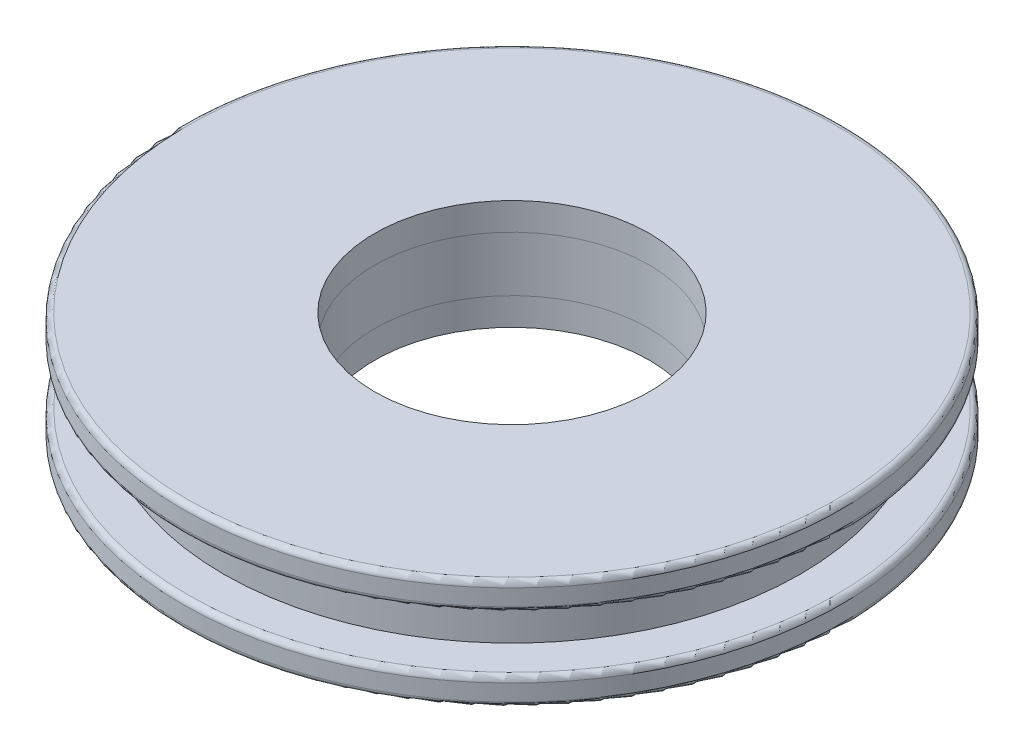
ISO-10303-21;
HEADER;
FILE_DESCRIPTION(('STEP AP214'),'2;1');
FILE_NAME('part.step','',(''),(''),'','','');
FILE_SCHEMA(('AUTOMOTIVE_DESIGN { 1 0 10303 214 1 1 1 1 }'));
ENDSEC;
DATA;
#1=APPLICATION_CONTEXT('core data for automotive mechanical design processes');
#2=APPLICATION_PROTOCOL_DEFINITION('international standard','automotive_design',2000,#1);
#3=PRODUCT_CONTEXT('',#1,'mechanical');
#4=PRODUCT('Part','Part','',(#3));
#5=PRODUCT_RELATED_PRODUCT_CATEGORY('part','',(#4));
#6=PRODUCT_DEFINITION_FORMATION('','',#4);
#7=PRODUCT_DEFINITION_CONTEXT('part definition',#1,'design');
#8=PRODUCT_DEFINITION('design','',#6,#7);
#9=PRODUCT_DEFINITION_SHAPE('','',#8);
#10=(LENGTH_UNIT() NAMED_UNIT(*) SI_UNIT(.MILLI.,.METRE.));
#11=(NAMED_UNIT(*) PLANE_ANGLE_UNIT() SI_UNIT($,.RADIAN.));
#12=(NAMED_UNIT(*) SI_UNIT($,.STERADIAN.) SOLID_ANGLE_UNIT());
#13=UNCERTAINTY_MEASURE_WITH_UNIT(LENGTH_MEASURE(1.E-05),#10,'distance_accuracy_value','');
#14=(GEOMETRIC_REPRESENTATION_CONTEXT(3) GLOBAL_UNCERTAINTY_ASSIGNED_CONTEXT((#13)) GLOBAL_UNIT_ASSIGNED_CONTEXT((#10,
#11,#12)) REPRESENTATION_CONTEXT('',''));
#15=CARTESIAN_POINT('',(0.,0.,0.));
#16=DIRECTION('',(0.,0.,1.));
#17=DIRECTION('',(1.,0.,0.));
#18=AXIS2_PLACEMENT_3D('',#15,#16,#17);
#19=CARTESIAN_POINT('',(0.,4.,0.));
#20=DIRECTION('',(0.,1.,0.));
#21=DIRECTION('',(0.,0.,1.));
#22=AXIS2_PLACEMENT_3D('',#19,#20,#21);
#23=PLANE('',#22);
#24=CARTESIAN_POINT('',(0.,4.,0.));
#25=DIRECTION('',(0.,1.,0.));
#26=DIRECTION('',(0.,0.,1.));
#27=AXIS2_PLACEMENT_3D('',#24,#25,#26);
#28=CIRCLE('',#27,11.8);
#29=CARTESIAN_POINT('',(0.,4.,11.8));
#30=VERTEX_POINT('',#29);
#31=EDGE_CURVE('E56',#30,#30,#28,.T.);
#32=ORIENTED_EDGE('',*,*,#31,.T.);
#33=EDGE_LOOP('',(#32));
#34=FACE_BOUND('',#33,.T.);
#35=CARTESIAN_POINT('',(0.,4.,0.));
#36=DIRECTION('',(0.,1.,0.));
#37=DIRECTION('',(0.,0.,1.));
#38=AXIS2_PLACEMENT_3D('',#35,#36,#37);
#39=CIRCLE('',#38,5.);
#40=CARTESIAN_POINT('',(0.,4.,5.));
#41=VERTEX_POINT('',#40);
#42=EDGE_CURVE('E61',#41,#41,#39,.T.);
#43=ORIENTED_EDGE('',*,*,#42,.F.);
#44=EDGE_LOOP('',(#43));
#45=FACE_BOUND('',#44,.T.);
#46=ADVANCED_FACE('F41',(#34,#45),#23,.T.);
#47=CARTESIAN_POINT('',(0.,3.,0.));
#48=DIRECTION('',(0.,1.,0.));
#49=DIRECTION('',(0.,0.,1.));
#50=AXIS2_PLACEMENT_3D('',#47,#48,#49);
#51=PLANE('',#50);
#52=CARTESIAN_POINT('',(0.,3.,0.));
#53=DIRECTION('',(0.,1.,0.));
#54=DIRECTION('',(0.,0.,1.));
#55=AXIS2_PLACEMENT_3D('',#52,#53,#54);
#56=CIRCLE('',#55,11.8);
#57=CARTESIAN_POINT('',(0.,3.,11.8));
#58=VERTEX_POINT('',#57);
#59=EDGE_CURVE('E11',#58,#58,#56,.F.);
#60=ORIENTED_EDGE('',*,*,#59,.T.);
#61=EDGE_LOOP('',(#60));
#62=FACE_BOUND('',#61,.T.);
#63=CARTESIAN_POINT('',(0.,3.,0.));
#64=DIRECTION('',(0.,1.,0.));
#65=DIRECTION('',(0.,0.,1.));
#66=AXIS2_PLACEMENT_3D('',#63,#64,#65);
#67=CIRCLE('',#66,5.);
#68=CARTESIAN_POINT('',(0.,3.,5.));
#69=VERTEX_POINT('',#68);
#70=EDGE_CURVE('E62',#69,#69,#67,.T.);
#71=ORIENTED_EDGE('',*,*,#70,.T.);
#72=EDGE_LOOP('',(#71));
#73=FACE_BOUND('',#72,.T.);
#74=ADVANCED_FACE('F72',(#62,#73),#51,.F.);
#75=CARTESIAN_POINT('',(0.,4.,0.));
#76=DIRECTION('',(0.,-1.,0.));
#77=DIRECTION('',(0.,0.,-1.));
#78=AXIS2_PLACEMENT_3D('',#75,#76,#77);
#79=CYLINDRICAL_SURFACE('',#78,12.);
#80=CARTESIAN_POINT('',(0.,3.2,0.));
#81=DIRECTION('',(0.,1.,0.));
#82=DIRECTION('',(0.,0.,1.));
#83=AXIS2_PLACEMENT_3D('',#80,#81,#82);
#84=CIRCLE('',#83,12.);
#85=CARTESIAN_POINT('',(0.,3.2,12.));
#86=VERTEX_POINT('',#85);
#87=EDGE_CURVE('E48',#86,#86,#84,.T.);
#88=ORIENTED_EDGE('',*,*,#87,.T.);
#89=EDGE_LOOP('',(#88));
#90=FACE_BOUND('',#89,.T.);
#91=CARTESIAN_POINT('',(0.,3.8,0.));
#92=DIRECTION('',(0.,1.,0.));
#93=DIRECTION('',(0.,0.,1.));
#94=AXIS2_PLACEMENT_3D('',#91,#92,#93);
#95=CIRCLE('',#94,12.);
#96=CARTESIAN_POINT('',(0.,3.8,12.));
#97=VERTEX_POINT('',#96);
#98=EDGE_CURVE('E52',#97,#97,#95,.F.);
#99=ORIENTED_EDGE('',*,*,#98,.T.);
#100=EDGE_LOOP('',(#99));
#101=FACE_BOUND('',#100,.T.);
#102=ADVANCED_FACE('F78',(#90,#101),#79,.T.);
#103=CARTESIAN_POINT('',(0.,4.,0.));
#104=DIRECTION('',(0.,-1.,0.));
#105=DIRECTION('',(0.,0.,-1.));
#106=AXIS2_PLACEMENT_3D('',#103,#104,#105);
#107=CYLINDRICAL_SURFACE('',#106,5.);
#108=ORIENTED_EDGE('',*,*,#42,.T.);
#109=EDGE_LOOP('',(#108));
#110=FACE_BOUND('',#109,.T.);
#111=ORIENTED_EDGE('',*,*,#70,.F.);
#112=EDGE_LOOP('',(#111));
#113=FACE_BOUND('',#112,.T.);
#114=ADVANCED_FACE('F68',(#110,#113),#107,.F.);
#115=CARTESIAN_POINT('',(0.,3.8,0.));
#116=DIRECTION('',(0.,1.,0.));
#117=DIRECTION('',(0.,0.,1.));
#118=AXIS2_PLACEMENT_3D('',#115,#116,#117);
#119=TOROIDAL_SURFACE('',#118,11.8,0.2);
#120=ORIENTED_EDGE('',*,*,#98,.F.);
#121=EDGE_LOOP('',(#120));
#122=FACE_BOUND('',#121,.T.);
#123=ORIENTED_EDGE('',*,*,#31,.F.);
#124=EDGE_LOOP('',(#123));
#125=FACE_BOUND('',#124,.T.);
#126=ADVANCED_FACE('F83',(#122,#125),#119,.T.);
#127=CARTESIAN_POINT('',(0.,3.2,0.));
#128=DIRECTION('',(0.,1.,0.));
#129=DIRECTION('',(0.,0.,1.));
#130=AXIS2_PLACEMENT_3D('',#127,#128,#129);
#131=TOROIDAL_SURFACE('',#130,11.8,0.2);
#132=ORIENTED_EDGE('',*,*,#59,.F.);
#133=EDGE_LOOP('',(#132));
#134=FACE_BOUND('',#133,.T.);
#135=ORIENTED_EDGE('',*,*,#87,.F.);
#136=EDGE_LOOP('',(#135));
#137=FACE_BOUND('',#136,.T.);
#138=ADVANCED_FACE('F43',(#134,#137),#131,.T.);
#139=CLOSED_SHELL('',(#46,#74,#102,#114,#126,#138));
#140=MANIFOLD_SOLID_BREP('B2',#139);
#141=CARTESIAN_POINT('',(0.,3.,0.));
#142=DIRECTION('',(0.,1.,0.));
#143=DIRECTION('',(0.,0.,1.));
#144=AXIS2_PLACEMENT_3D('',#141,#142,#143);
#145=PLANE('',#144);
#146=CARTESIAN_POINT('',(0.,3.,0.));
#147=DIRECTION('',(0.,1.,0.));
#148=DIRECTION('',(0.,0.,1.));
#149=AXIS2_PLACEMENT_3D('',#146,#147,#148);
#150=CIRCLE('',#149,5.);
#151=CARTESIAN_POINT('',(0.,3.,5.));
#152=VERTEX_POINT('',#151);
#153=EDGE_CURVE('E40',#152,#152,#150,.T.);
#154=ORIENTED_EDGE('',*,*,#153,.F.);
#155=EDGE_LOOP('',(#154));
#156=FACE_BOUND('',#155,.T.);
#157=CARTESIAN_POINT('',(0.,3.,0.));
#158=DIRECTION('',(0.,1.,0.));
#159=DIRECTION('',(0.,0.,1.));
#160=AXIS2_PLACEMENT_3D('',#157,#158,#159);
#161=CIRCLE('',#160,10.5);
#162=CARTESIAN_POINT('',(0.,3.,10.5));
#163=VERTEX_POINT('',#162);
#164=EDGE_CURVE('E154',#163,#163,#161,.T.);
#165=ORIENTED_EDGE('',*,*,#164,.T.);
#166=EDGE_LOOP('',(#165));
#167=FACE_BOUND('',#166,.T.);
#168=ADVANCED_FACE('F139',(#156,#167),#145,.T.);
#169=CARTESIAN_POINT('',(0.,1.,0.));
#170=DIRECTION('',(0.,1.,0.));
#171=DIRECTION('',(0.,0.,1.));
#172=AXIS2_PLACEMENT_3D('',#169,#170,#171);
#173=PLANE('',#172);
#174=CARTESIAN_POINT('',(0.,1.,0.));
#175=DIRECTION('',(0.,1.,0.));
#176=DIRECTION('',(0.,0.,1.));
#177=AXIS2_PLACEMENT_3D('',#174,#175,#176);
#178=CIRCLE('',#177,5.);
#179=CARTESIAN_POINT('',(0.,1.,5.));
#180=VERTEX_POINT('',#179);
#181=EDGE_CURVE('E143',#180,#180,#178,.T.);
#182=ORIENTED_EDGE('',*,*,#181,.T.);
#183=EDGE_LOOP('',(#182));
#184=FACE_BOUND('',#183,.T.);
#185=CARTESIAN_POINT('',(0.,1.,0.));
#186=DIRECTION('',(0.,1.,0.));
#187=DIRECTION('',(0.,0.,1.));
#188=AXIS2_PLACEMENT_3D('',#185,#186,#187);
#189=CIRCLE('',#188,10.5);
#190=CARTESIAN_POINT('',(0.,1.,10.5));
#191=VERTEX_POINT('',#190);
#192=EDGE_CURVE('E150',#191,#191,#189,.T.);
#193=ORIENTED_EDGE('',*,*,#192,.F.);
#194=EDGE_LOOP('',(#193));
#195=FACE_BOUND('',#194,.T.);
#196=ADVANCED_FACE('F141',(#184,#195),#173,.F.);
#197=CARTESIAN_POINT('',(0.,3.,0.));
#198=DIRECTION('',(0.,-1.,0.));
#199=DIRECTION('',(0.,0.,-1.));
#200=AXIS2_PLACEMENT_3D('',#197,#198,#199);
#201=CYLINDRICAL_SURFACE('',#200,5.);
#202=ORIENTED_EDGE('',*,*,#153,.T.);
#203=EDGE_LOOP('',(#202));
#204=FACE_BOUND('',#203,.T.);
#205=ORIENTED_EDGE('',*,*,#181,.F.);
#206=EDGE_LOOP('',(#205));
#207=FACE_BOUND('',#206,.T.);
#208=ADVANCED_FACE('F161',(#204,#207),#201,.F.);
#209=CARTESIAN_POINT('',(0.,3.,0.));
#210=DIRECTION('',(0.,1.,0.));
#211=DIRECTION('',(0.,0.,1.));
#212=AXIS2_PLACEMENT_3D('',#209,#210,#211);
#213=CYLINDRICAL_SURFACE('',#212,10.5);
#214=ORIENTED_EDGE('',*,*,#192,.T.);
#215=EDGE_LOOP('',(#214));
#216=FACE_BOUND('',#215,.T.);
#217=ORIENTED_EDGE('',*,*,#164,.F.);
#218=EDGE_LOOP('',(#217));
#219=FACE_BOUND('',#218,.T.);
#220=ADVANCED_FACE('F159',(#216,#219),#213,.T.);
#221=CLOSED_SHELL('',(#168,#196,#208,#220));
#222=MANIFOLD_SOLID_BREP('B6',#221);
#223=CARTESIAN_POINT('',(0.,1.,0.));
#224=DIRECTION('',(0.,1.,0.));
#225=DIRECTION('',(0.,0.,1.));
#226=AXIS2_PLACEMENT_3D('',#223,#224,#225);
#227=PLANE('',#226);
#228=CARTESIAN_POINT('',(0.,1.,0.));
#229=DIRECTION('',(0.,1.,0.));
#230=DIRECTION('',(0.,0.,1.));
#231=AXIS2_PLACEMENT_3D('',#228,#229,#230);
#232=CIRCLE('',#231,11.8);
#233=CARTESIAN_POINT('',(0.,1.,11.8));
#234=VERTEX_POINT('',#233);
#235=EDGE_CURVE('E215',#234,#234,#232,.T.);
#236=ORIENTED_EDGE('',*,*,#235,.T.);
#237=EDGE_LOOP('',(#236));
#238=FACE_BOUND('',#237,.T.);
#239=CARTESIAN_POINT('',(0.,1.,0.));
#240=DIRECTION('',(0.,1.,0.));
#241=DIRECTION('',(0.,0.,1.));
#242=AXIS2_PLACEMENT_3D('',#239,#240,#241);
#243=CIRCLE('',#242,5.);
#244=CARTESIAN_POINT('',(0.,1.,5.));
#245=VERTEX_POINT('',#244);
#246=EDGE_CURVE('E220',#245,#245,#243,.T.);
#247=ORIENTED_EDGE('',*,*,#246,.F.);
#248=EDGE_LOOP('',(#247));
#249=FACE_BOUND('',#248,.T.);
#250=ADVANCED_FACE('F200',(#238,#249),#227,.T.);
#251=CARTESIAN_POINT('',(0.,0.,0.));
#252=DIRECTION('',(0.,1.,0.));
#253=DIRECTION('',(0.,0.,1.));
#254=AXIS2_PLACEMENT_3D('',#251,#252,#253);
#255=PLANE('',#254);
#256=CARTESIAN_POINT('',(0.,0.,0.));
#257=DIRECTION('',(0.,1.,0.));
#258=DIRECTION('',(0.,0.,1.));
#259=AXIS2_PLACEMENT_3D('',#256,#257,#258);
#260=CIRCLE('',#259,11.8);
#261=CARTESIAN_POINT('',(0.,0.,11.8));
#262=VERTEX_POINT('',#261);
#263=EDGE_CURVE('E138',#262,#262,#260,.F.);
#264=ORIENTED_EDGE('',*,*,#263,.T.);
#265=EDGE_LOOP('',(#264));
#266=FACE_BOUND('',#265,.T.);
#267=CARTESIAN_POINT('',(0.,0.,0.));
#268=DIRECTION('',(0.,1.,0.));
#269=DIRECTION('',(0.,0.,1.));
#270=AXIS2_PLACEMENT_3D('',#267,#268,#269);
#271=CIRCLE('',#270,5.);
#272=CARTESIAN_POINT('',(0.,0.,5.));
#273=VERTEX_POINT('',#272);
#274=EDGE_CURVE('E221',#273,#273,#271,.T.);
#275=ORIENTED_EDGE('',*,*,#274,.T.);
#276=EDGE_LOOP('',(#275));
#277=FACE_BOUND('',#276,.T.);
#278=ADVANCED_FACE('F231',(#266,#277),#255,.F.);
#279=CARTESIAN_POINT('',(0.,1.,0.));
#280=DIRECTION('',(0.,-1.,0.));
#281=DIRECTION('',(0.,0.,-1.));
#282=AXIS2_PLACEMENT_3D('',#279,#280,#281);
#283=CYLINDRICAL_SURFACE('',#282,12.);
#284=CARTESIAN_POINT('',(0.,0.2,0.));
#285=DIRECTION('',(0.,1.,0.));
#286=DIRECTION('',(0.,0.,1.));
#287=AXIS2_PLACEMENT_3D('',#284,#285,#286);
#288=CIRCLE('',#287,12.);
#289=CARTESIAN_POINT('',(0.,0.2,12.));
#290=VERTEX_POINT('',#289);
#291=EDGE_CURVE('E207',#290,#290,#288,.T.);
#292=ORIENTED_EDGE('',*,*,#291,.T.);
#293=EDGE_LOOP('',(#292));
#294=FACE_BOUND('',#293,.T.);
#295=CARTESIAN_POINT('',(0.,0.8,0.));
#296=DIRECTION('',(0.,1.,0.));
#297=DIRECTION('',(0.,0.,1.));
#298=AXIS2_PLACEMENT_3D('',#295,#296,#297);
#299=CIRCLE('',#298,12.);
#300=CARTESIAN_POINT('',(0.,0.8,12.));
#301=VERTEX_POINT('',#300);
#302=EDGE_CURVE('E211',#301,#301,#299,.F.);
#303=ORIENTED_EDGE('',*,*,#302,.T.);
#304=EDGE_LOOP('',(#303));
#305=FACE_BOUND('',#304,.T.);
#306=ADVANCED_FACE('F237',(#294,#305),#283,.T.);
#307=CARTESIAN_POINT('',(0.,1.,0.));
#308=DIRECTION('',(0.,-1.,0.));
#309=DIRECTION('',(0.,0.,-1.));
#310=AXIS2_PLACEMENT_3D('',#307,#308,#309);
#311=CYLINDRICAL_SURFACE('',#310,5.);
#312=ORIENTED_EDGE('',*,*,#246,.T.);
#313=EDGE_LOOP('',(#312));
#314=FACE_BOUND('',#313,.T.);
#315=ORIENTED_EDGE('',*,*,#274,.F.);
#316=EDGE_LOOP('',(#315));
#317=FACE_BOUND('',#316,.T.);
#318=ADVANCED_FACE('F227',(#314,#317),#311,.F.);
#319=CARTESIAN_POINT('',(0.,0.8,0.));
#320=DIRECTION('',(0.,1.,0.));
#321=DIRECTION('',(0.,0.,1.));
#322=AXIS2_PLACEMENT_3D('',#319,#320,#321);
#323=TOROIDAL_SURFACE('',#322,11.8,0.2);
#324=ORIENTED_EDGE('',*,*,#302,.F.);
#325=EDGE_LOOP('',(#324));
#326=FACE_BOUND('',#325,.T.);
#327=ORIENTED_EDGE('',*,*,#235,.F.);
#328=EDGE_LOOP('',(#327));
#329=FACE_BOUND('',#328,.T.);
#330=ADVANCED_FACE('F242',(#326,#329),#323,.T.);
#331=CARTESIAN_POINT('',(0.,0.2,0.));
#332=DIRECTION('',(0.,1.,0.));
#333=DIRECTION('',(0.,0.,1.));
#334=AXIS2_PLACEMENT_3D('',#331,#332,#333);
#335=TOROIDAL_SURFACE('',#334,11.8,0.2);
#336=ORIENTED_EDGE('',*,*,#263,.F.);
#337=EDGE_LOOP('',(#336));
#338=FACE_BOUND('',#337,.T.);
#339=ORIENTED_EDGE('',*,*,#291,.F.);
#340=EDGE_LOOP('',(#339));
#341=FACE_BOUND('',#340,.T.);
#342=ADVANCED_FACE('F202',(#338,#341),#335,.T.);
#343=CLOSED_SHELL('',(#250,#278,#306,#318,#330,#342));
#344=MANIFOLD_SOLID_BREP('B35',#343);
#345=ADVANCED_BREP_SHAPE_REPRESENTATION('',(#18,#140,#222,#344),#14);
#346=SHAPE_DEFINITION_REPRESENTATION(#9,#345);
ENDSEC;
END-ISO-10303-21;
